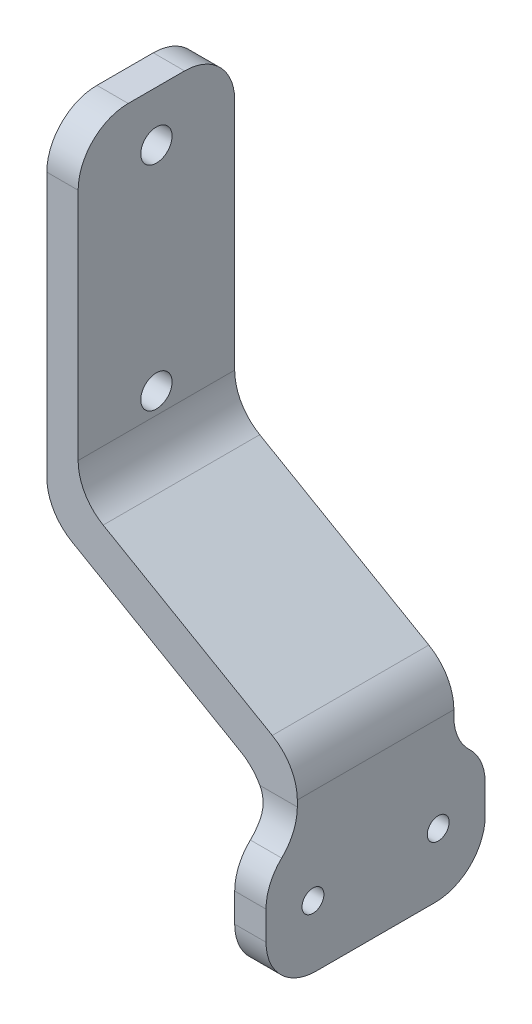
ISO-10303-21;
HEADER;
FILE_DESCRIPTION(('STEP AP214'),'2;1');
FILE_NAME('part.step','',(''),(''),'','','');
FILE_SCHEMA(('AUTOMOTIVE_DESIGN { 1 0 10303 214 1 1 1 1 }'));
ENDSEC;
DATA;
#1=APPLICATION_CONTEXT('core data for automotive mechanical design processes');
#2=APPLICATION_PROTOCOL_DEFINITION('international standard','automotive_design',2000,#1);
#3=PRODUCT_CONTEXT('',#1,'mechanical');
#4=PRODUCT('Part','Part','',(#3));
#5=PRODUCT_RELATED_PRODUCT_CATEGORY('part','',(#4));
#6=PRODUCT_DEFINITION_FORMATION('','',#4);
#7=PRODUCT_DEFINITION_CONTEXT('part definition',#1,'design');
#8=PRODUCT_DEFINITION('design','',#6,#7);
#9=PRODUCT_DEFINITION_SHAPE('','',#8);
#10=(LENGTH_UNIT() NAMED_UNIT(*) SI_UNIT(.MILLI.,.METRE.));
#11=(NAMED_UNIT(*) PLANE_ANGLE_UNIT() SI_UNIT($,.RADIAN.));
#12=(NAMED_UNIT(*) SI_UNIT($,.STERADIAN.) SOLID_ANGLE_UNIT());
#13=UNCERTAINTY_MEASURE_WITH_UNIT(LENGTH_MEASURE(1.E-05),#10,'distance_accuracy_value','');
#14=(GEOMETRIC_REPRESENTATION_CONTEXT(3) GLOBAL_UNCERTAINTY_ASSIGNED_CONTEXT((#13)) GLOBAL_UNIT_ASSIGNED_CONTEXT((#10,
#11,#12)) REPRESENTATION_CONTEXT('',''));
#15=CARTESIAN_POINT('',(0.,0.,0.));
#16=DIRECTION('',(0.,0.,1.));
#17=DIRECTION('',(1.,0.,0.));
#18=AXIS2_PLACEMENT_3D('',#15,#16,#17);
#19=CARTESIAN_POINT('',(0.,0.,12.5));
#20=DIRECTION('',(0.,0.,-1.));
#21=DIRECTION('',(-1.,0.,0.));
#22=AXIS2_PLACEMENT_3D('',#19,#20,#21);
#23=PLANE('',#22);
#24=CARTESIAN_POINT('',(22.,-4.61880215351701,12.5));
#25=DIRECTION('',(0.,0.,-1.));
#26=DIRECTION('',(-1.,0.,0.));
#27=AXIS2_PLACEMENT_3D('',#24,#25,#26);
#28=CIRCLE('',#27,8.);
#29=CARTESIAN_POINT('',(26.,2.3094010767585,12.5));
#30=VERTEX_POINT('',#29);
#31=CARTESIAN_POINT('',(29.0282093935417,-0.797248448473425,12.5));
#32=VERTEX_POINT('',#31);
#33=EDGE_CURVE('E350',#30,#32,#28,.T.);
#34=ORIENTED_EDGE('',*,*,#33,.T.);
#35=DIRECTION('',(-1.,0.,0.));
#36=VECTOR('',#35,1.);
#37=CARTESIAN_POINT('',(0.,-0.797248448473424,12.5));
#38=LINE('',#37,#36);
#39=CARTESIAN_POINT('',(35.,-0.797248448473424,12.5));
#40=VERTEX_POINT('',#39);
#41=EDGE_CURVE('E371',#32,#40,#38,.F.);
#42=ORIENTED_EDGE('',*,*,#41,.T.);
#43=DIRECTION('',(0.,-1.,0.));
#44=VECTOR('',#43,1.);
#45=CARTESIAN_POINT('',(35.,0.,12.5));
#46=LINE('',#45,#44);
#47=CARTESIAN_POINT('',(35.,0.173938424846068,12.5));
#48=VERTEX_POINT('',#47);
#49=EDGE_CURVE('E224',#48,#40,#46,.T.);
#50=ORIENTED_EDGE('',*,*,#49,.F.);
#51=CARTESIAN_POINT('',(27.,0.173938424846068,12.5));
#52=DIRECTION('',(0.,0.,-1.));
#53=DIRECTION('',(-1.,0.,0.));
#54=AXIS2_PLACEMENT_3D('',#51,#52,#53);
#55=CIRCLE('',#54,8.);
#56=CARTESIAN_POINT('',(31.,7.10214165512157,12.5));
#57=VERTEX_POINT('',#56);
#58=EDGE_CURVE('E300',#48,#57,#55,.F.);
#59=ORIENTED_EDGE('',*,*,#58,.T.);
#60=DIRECTION('',(-0.866025403784438,0.500000000000001,0.));
#61=VECTOR('',#60,1.);
#62=CARTESIAN_POINT('',(35.,4.79274057836307,12.5));
#63=LINE('',#62,#61);
#64=CARTESIAN_POINT('',(3.99999999999998,22.6905989232415,12.5));
#65=VERTEX_POINT('',#64);
#66=EDGE_CURVE('E230',#57,#65,#63,.T.);
#67=ORIENTED_EDGE('',*,*,#66,.T.);
#68=CARTESIAN_POINT('',(8.,29.618802153517,12.5));
#69=DIRECTION('',(0.,0.,-1.));
#70=DIRECTION('',(-1.,0.,0.));
#71=AXIS2_PLACEMENT_3D('',#68,#69,#70);
#72=CIRCLE('',#71,8.);
#73=CARTESIAN_POINT('',(0.,29.618802153517,12.5));
#74=VERTEX_POINT('',#73);
#75=EDGE_CURVE('E357',#65,#74,#72,.T.);
#76=ORIENTED_EDGE('',*,*,#75,.T.);
#77=DIRECTION('',(0.,1.,0.));
#78=VECTOR('',#77,1.);
#79=CARTESIAN_POINT('',(0.,0.,12.5));
#80=LINE('',#79,#78);
#81=CARTESIAN_POINT('',(0.,67.,12.5));
#82=VERTEX_POINT('',#81);
#83=EDGE_CURVE('E515',#74,#82,#80,.T.);
#84=ORIENTED_EDGE('',*,*,#83,.T.);
#85=DIRECTION('',(1.,0.,0.));
#86=VECTOR('',#85,1.);
#87=CARTESIAN_POINT('',(-5.,67.,12.5));
#88=LINE('',#87,#86);
#89=CARTESIAN_POINT('',(-5.,67.,12.5));
#90=VERTEX_POINT('',#89);
#91=EDGE_CURVE('E294',#82,#90,#88,.F.);
#92=ORIENTED_EDGE('',*,*,#91,.T.);
#93=DIRECTION('',(0.,1.,0.));
#94=VECTOR('',#93,1.);
#95=CARTESIAN_POINT('',(-5.,0.,12.5));
#96=LINE('',#95,#94);
#97=CARTESIAN_POINT('',(-5.,24.8260615751539,12.5));
#98=VERTEX_POINT('',#97);
#99=EDGE_CURVE('E535',#98,#90,#96,.T.);
#100=ORIENTED_EDGE('',*,*,#99,.F.);
#101=CARTESIAN_POINT('',(3.,24.8260615751539,12.5));
#102=DIRECTION('',(0.,0.,-1.));
#103=DIRECTION('',(-1.,0.,0.));
#104=AXIS2_PLACEMENT_3D('',#101,#102,#103);
#105=CIRCLE('',#104,8.);
#106=CARTESIAN_POINT('',(-1.00000000000001,17.8978583448784,12.5));
#107=VERTEX_POINT('',#106);
#108=EDGE_CURVE('E297',#98,#107,#105,.F.);
#109=ORIENTED_EDGE('',*,*,#108,.T.);
#110=DIRECTION('',(0.866025403784438,-0.500000000000001,0.));
#111=VECTOR('',#110,1.);
#112=CARTESIAN_POINT('',(-5.,20.2072594216369,12.5));
#113=LINE('',#112,#111);
#114=EDGE_CURVE('E234',#107,#30,#113,.T.);
#115=ORIENTED_EDGE('',*,*,#114,.T.);
#116=EDGE_LOOP('',(#34,#42,#50,#59,#67,#76,#84,#92,#100,#109,#115));
#117=FACE_BOUND('',#116,.T.);
#118=ADVANCED_FACE('F43',(#117),#23,.F.);
#119=CARTESIAN_POINT('',(0.,0.,-12.5));
#120=DIRECTION('',(0.,0.,-1.));
#121=DIRECTION('',(-1.,0.,0.));
#122=AXIS2_PLACEMENT_3D('',#119,#120,#121);
#123=PLANE('',#122);
#124=DIRECTION('',(0.,1.,0.));
#125=VECTOR('',#124,1.);
#126=CARTESIAN_POINT('',(35.,0.,-12.5));
#127=LINE('',#126,#125);
#128=CARTESIAN_POINT('',(35.,-0.797248448473403,-12.5));
#129=VERTEX_POINT('',#128);
#130=CARTESIAN_POINT('',(35.,0.173938424846068,-12.5));
#131=VERTEX_POINT('',#130);
#132=EDGE_CURVE('E235',#129,#131,#127,.T.);
#133=ORIENTED_EDGE('',*,*,#132,.F.);
#134=DIRECTION('',(1.,0.,0.));
#135=VECTOR('',#134,1.);
#136=CARTESIAN_POINT('',(30.,-0.797248448473403,-12.5));
#137=LINE('',#136,#135);
#138=CARTESIAN_POINT('',(29.0282093935417,-0.797248448473402,-12.5));
#139=VERTEX_POINT('',#138);
#140=EDGE_CURVE('E360',#129,#139,#137,.F.);
#141=ORIENTED_EDGE('',*,*,#140,.T.);
#142=CARTESIAN_POINT('',(22.,-4.61880215351701,-12.5));
#143=DIRECTION('',(0.,0.,-1.));
#144=DIRECTION('',(-1.,0.,0.));
#145=AXIS2_PLACEMENT_3D('',#142,#143,#144);
#146=CIRCLE('',#145,8.);
#147=CARTESIAN_POINT('',(26.,2.3094010767585,-12.5));
#148=VERTEX_POINT('',#147);
#149=EDGE_CURVE('E347',#139,#148,#146,.F.);
#150=ORIENTED_EDGE('',*,*,#149,.T.);
#151=DIRECTION('',(-0.866025403784438,0.500000000000001,0.));
#152=VECTOR('',#151,1.);
#153=CARTESIAN_POINT('',(7.50000000000002,12.9903810567666,-12.5));
#154=LINE('',#153,#152);
#155=CARTESIAN_POINT('',(-1.,17.8978583448784,-12.5));
#156=VERTEX_POINT('',#155);
#157=EDGE_CURVE('E243',#148,#156,#154,.T.);
#158=ORIENTED_EDGE('',*,*,#157,.T.);
#159=CARTESIAN_POINT('',(3.,24.8260615751539,-12.5));
#160=DIRECTION('',(0.,0.,-1.));
#161=DIRECTION('',(-1.,0.,0.));
#162=AXIS2_PLACEMENT_3D('',#159,#160,#161);
#163=CIRCLE('',#162,8.);
#164=CARTESIAN_POINT('',(-5.,24.8260615751539,-12.5));
#165=VERTEX_POINT('',#164);
#166=EDGE_CURVE('E313',#156,#165,#163,.T.);
#167=ORIENTED_EDGE('',*,*,#166,.T.);
#168=DIRECTION('',(0.,1.,0.));
#169=VECTOR('',#168,1.);
#170=CARTESIAN_POINT('',(-5.,0.,-12.5));
#171=LINE('',#170,#169);
#172=CARTESIAN_POINT('',(-5.,67.,-12.5));
#173=VERTEX_POINT('',#172);
#174=EDGE_CURVE('E226',#165,#173,#171,.T.);
#175=ORIENTED_EDGE('',*,*,#174,.T.);
#176=DIRECTION('',(1.,0.,0.));
#177=VECTOR('',#176,1.);
#178=CARTESIAN_POINT('',(0.,67.,-12.5));
#179=LINE('',#178,#177);
#180=CARTESIAN_POINT('',(0.,67.,-12.5));
#181=VERTEX_POINT('',#180);
#182=EDGE_CURVE('E309',#173,#181,#179,.T.);
#183=ORIENTED_EDGE('',*,*,#182,.T.);
#184=DIRECTION('',(0.,1.,0.));
#185=VECTOR('',#184,1.);
#186=CARTESIAN_POINT('',(0.,0.,-12.5));
#187=LINE('',#186,#185);
#188=CARTESIAN_POINT('',(0.,29.618802153517,-12.5));
#189=VERTEX_POINT('',#188);
#190=EDGE_CURVE('E523',#189,#181,#187,.T.);
#191=ORIENTED_EDGE('',*,*,#190,.F.);
#192=CARTESIAN_POINT('',(8.,29.618802153517,-12.5));
#193=DIRECTION('',(0.,0.,-1.));
#194=DIRECTION('',(-1.,0.,0.));
#195=AXIS2_PLACEMENT_3D('',#192,#193,#194);
#196=CIRCLE('',#195,8.);
#197=CARTESIAN_POINT('',(3.99999999999999,22.6905989232415,-12.5));
#198=VERTEX_POINT('',#197);
#199=EDGE_CURVE('E354',#189,#198,#196,.F.);
#200=ORIENTED_EDGE('',*,*,#199,.T.);
#201=DIRECTION('',(0.866025403784438,-0.500000000000001,0.));
#202=VECTOR('',#201,1.);
#203=CARTESIAN_POINT('',(10.8253175473055,18.75,-12.5));
#204=LINE('',#203,#202);
#205=CARTESIAN_POINT('',(31.,7.10214165512157,-12.5));
#206=VERTEX_POINT('',#205);
#207=EDGE_CURVE('E239',#198,#206,#204,.T.);
#208=ORIENTED_EDGE('',*,*,#207,.T.);
#209=CARTESIAN_POINT('',(27.,0.173938424846068,-12.5));
#210=DIRECTION('',(0.,0.,-1.));
#211=DIRECTION('',(-1.,0.,0.));
#212=AXIS2_PLACEMENT_3D('',#209,#210,#211);
#213=CIRCLE('',#212,8.);
#214=EDGE_CURVE('E316',#206,#131,#213,.T.);
#215=ORIENTED_EDGE('',*,*,#214,.T.);
#216=EDGE_LOOP('',(#133,#141,#150,#158,#167,#175,#183,#191,#200,#208,#215));
#217=FACE_BOUND('',#216,.T.);
#218=ADVANCED_FACE('F417',(#217),#123,.T.);
#219=CARTESIAN_POINT('',(30.,0.,0.));
#220=DIRECTION('',(1.,0.,0.));
#221=DIRECTION('',(0.,0.,-1.));
#222=AXIS2_PLACEMENT_3D('',#219,#220,#221);
#223=PLANE('',#222);
#224=CARTESIAN_POINT('',(30.,-15.,10.));
#225=DIRECTION('',(1.,0.,0.));
#226=DIRECTION('',(0.,0.,-1.));
#227=AXIS2_PLACEMENT_3D('',#224,#225,#226);
#228=CIRCLE('',#227,1.75);
#229=CARTESIAN_POINT('',(30.,-15.,8.25));
#230=VERTEX_POINT('',#229);
#231=EDGE_CURVE('E529',#230,#230,#228,.T.);
#232=ORIENTED_EDGE('',*,*,#231,.T.);
#233=EDGE_LOOP('',(#232));
#234=FACE_BOUND('',#233,.T.);
#235=CARTESIAN_POINT('',(30.,-15.,-10.));
#236=DIRECTION('',(1.,0.,0.));
#237=DIRECTION('',(0.,0.,-1.));
#238=AXIS2_PLACEMENT_3D('',#235,#236,#237);
#239=CIRCLE('',#238,1.75);
#240=CARTESIAN_POINT('',(30.,-15.,-11.75));
#241=VERTEX_POINT('',#240);
#242=EDGE_CURVE('E545',#241,#241,#239,.T.);
#243=ORIENTED_EDGE('',*,*,#242,.T.);
#244=EDGE_LOOP('',(#243));
#245=FACE_BOUND('',#244,.T.);
#246=DIRECTION('',(0.,0.,-1.));
#247=VECTOR('',#246,1.);
#248=CARTESIAN_POINT('',(30.,-25.,0.));
#249=LINE('',#248,#247);
#250=CARTESIAN_POINT('',(30.,-25.,9.49999999999998));
#251=VERTEX_POINT('',#250);
#252=CARTESIAN_POINT('',(30.,-25.,-9.50000000000002));
#253=VERTEX_POINT('',#252);
#254=EDGE_CURVE('E207',#251,#253,#249,.T.);
#255=ORIENTED_EDGE('',*,*,#254,.F.);
#256=CARTESIAN_POINT('',(30.,-17.,9.49999999999998));
#257=DIRECTION('',(1.,0.,0.));
#258=DIRECTION('',(0.,0.,-1.));
#259=AXIS2_PLACEMENT_3D('',#256,#257,#258);
#260=CIRCLE('',#259,8.);
#261=CARTESIAN_POINT('',(30.,-17.,17.5));
#262=VERTEX_POINT('',#261);
#263=EDGE_CURVE('E190',#251,#262,#260,.F.);
#264=ORIENTED_EDGE('',*,*,#263,.T.);
#265=DIRECTION('',(0.,1.,0.));
#266=VECTOR('',#265,1.);
#267=CARTESIAN_POINT('',(30.,0.,17.5));
#268=LINE('',#267,#266);
#269=CARTESIAN_POINT('',(30.,-12.4161984870957,17.5));
#270=VERTEX_POINT('',#269);
#271=EDGE_CURVE('E219',#262,#270,#268,.T.);
#272=ORIENTED_EDGE('',*,*,#271,.T.);
#273=CARTESIAN_POINT('',(30.,-12.4161984870957,9.49999999999999));
#274=DIRECTION('',(1.,0.,0.));
#275=DIRECTION('',(0.,0.,-1.));
#276=AXIS2_PLACEMENT_3D('',#273,#274,#275);
#277=CIRCLE('',#276,8.);
#278=CARTESIAN_POINT('',(30.,-6.60672346778454,15.));
#279=VERTEX_POINT('',#278);
#280=EDGE_CURVE('E201',#270,#279,#277,.F.);
#281=ORIENTED_EDGE('',*,*,#280,.T.);
#282=CARTESIAN_POINT('',(30.,-0.797248448473424,20.5));
#283=DIRECTION('',(1.,0.,0.));
#284=DIRECTION('',(0.,0.,-1.));
#285=AXIS2_PLACEMENT_3D('',#282,#283,#284);
#286=CIRCLE('',#285,8.);
#287=CARTESIAN_POINT('',(30.,-4.61880215351701,13.4717906064583));
#288=VERTEX_POINT('',#287);
#289=EDGE_CURVE('E468',#279,#288,#286,.T.);
#290=ORIENTED_EDGE('',*,*,#289,.T.);
#291=DIRECTION('',(0.,0.,-1.));
#292=VECTOR('',#291,1.);
#293=CARTESIAN_POINT('',(30.,-4.61880215351701,0.));
#294=LINE('',#293,#292);
#295=CARTESIAN_POINT('',(30.,-4.61880215351701,-13.4717906064583));
#296=VERTEX_POINT('',#295);
#297=EDGE_CURVE('E60',#288,#296,#294,.T.);
#298=ORIENTED_EDGE('',*,*,#297,.T.);
#299=CARTESIAN_POINT('',(30.,-0.797248448473403,-20.5));
#300=DIRECTION('',(1.,0.,0.));
#301=DIRECTION('',(0.,0.,-1.));
#302=AXIS2_PLACEMENT_3D('',#299,#300,#301);
#303=CIRCLE('',#302,8.);
#304=CARTESIAN_POINT('',(30.,-6.60672346778454,-15.));
#305=VERTEX_POINT('',#304);
#306=EDGE_CURVE('E382',#296,#305,#303,.T.);
#307=ORIENTED_EDGE('',*,*,#306,.T.);
#308=CARTESIAN_POINT('',(30.,-12.4161984870957,-9.50000000000002));
#309=DIRECTION('',(1.,0.,0.));
#310=DIRECTION('',(0.,0.,-1.));
#311=AXIS2_PLACEMENT_3D('',#308,#309,#310);
#312=CIRCLE('',#311,8.);
#313=CARTESIAN_POINT('',(30.,-12.4161984870957,-17.5));
#314=VERTEX_POINT('',#313);
#315=EDGE_CURVE('E251',#305,#314,#312,.F.);
#316=ORIENTED_EDGE('',*,*,#315,.T.);
#317=DIRECTION('',(0.,1.,0.));
#318=VECTOR('',#317,1.);
#319=CARTESIAN_POINT('',(30.,0.,-17.5));
#320=LINE('',#319,#318);
#321=CARTESIAN_POINT('',(30.,-17.,-17.5));
#322=VERTEX_POINT('',#321);
#323=EDGE_CURVE('E218',#322,#314,#320,.T.);
#324=ORIENTED_EDGE('',*,*,#323,.F.);
#325=CARTESIAN_POINT('',(30.,-17.,-9.50000000000002));
#326=DIRECTION('',(1.,0.,0.));
#327=DIRECTION('',(0.,0.,-1.));
#328=AXIS2_PLACEMENT_3D('',#325,#326,#327);
#329=CIRCLE('',#328,8.);
#330=EDGE_CURVE('E216',#322,#253,#329,.F.);
#331=ORIENTED_EDGE('',*,*,#330,.T.);
#332=EDGE_LOOP('',(#255,#264,#272,#281,#290,#298,#307,#316,#324,#331));
#333=FACE_BOUND('',#332,.T.);
#334=ADVANCED_FACE('F214',(#234,#245,#333),#223,.F.);
#335=CARTESIAN_POINT('',(35.,0.,17.5));
#336=DIRECTION('',(0.,0.,1.));
#337=DIRECTION('',(0.,-1.,0.));
#338=AXIS2_PLACEMENT_3D('',#335,#336,#337);
#339=PLANE('',#338);
#340=ORIENTED_EDGE('',*,*,#271,.F.);
#341=DIRECTION('',(-1.,0.,0.));
#342=VECTOR('',#341,1.);
#343=CARTESIAN_POINT('',(35.,-17.,17.5));
#344=LINE('',#343,#342);
#345=CARTESIAN_POINT('',(35.,-17.,17.5));
#346=VERTEX_POINT('',#345);
#347=EDGE_CURVE('E195',#262,#346,#344,.F.);
#348=ORIENTED_EDGE('',*,*,#347,.T.);
#349=DIRECTION('',(0.,1.,0.));
#350=VECTOR('',#349,1.);
#351=CARTESIAN_POINT('',(35.,0.,17.5));
#352=LINE('',#351,#350);
#353=CARTESIAN_POINT('',(35.,-12.4161984870957,17.5));
#354=VERTEX_POINT('',#353);
#355=EDGE_CURVE('E493',#346,#354,#352,.T.);
#356=ORIENTED_EDGE('',*,*,#355,.T.);
#357=DIRECTION('',(1.,0.,0.));
#358=VECTOR('',#357,1.);
#359=CARTESIAN_POINT('',(30.,-12.4161984870957,17.5));
#360=LINE('',#359,#358);
#361=EDGE_CURVE('E200',#354,#270,#360,.F.);
#362=ORIENTED_EDGE('',*,*,#361,.T.);
#363=EDGE_LOOP('',(#340,#348,#356,#362));
#364=FACE_BOUND('',#363,.T.);
#365=ADVANCED_FACE('F426',(#364),#339,.T.);
#366=CARTESIAN_POINT('',(35.,-25.,0.));
#367=DIRECTION('',(0.,1.,0.));
#368=DIRECTION('',(0.,0.,1.));
#369=AXIS2_PLACEMENT_3D('',#366,#367,#368);
#370=PLANE('',#369);
#371=DIRECTION('',(0.,0.,-1.));
#372=VECTOR('',#371,1.);
#373=CARTESIAN_POINT('',(35.,-25.,0.));
#374=LINE('',#373,#372);
#375=CARTESIAN_POINT('',(35.,-25.,9.49999999999998));
#376=VERTEX_POINT('',#375);
#377=CARTESIAN_POINT('',(35.,-25.,-9.50000000000002));
#378=VERTEX_POINT('',#377);
#379=EDGE_CURVE('E210',#376,#378,#374,.T.);
#380=ORIENTED_EDGE('',*,*,#379,.F.);
#381=DIRECTION('',(-1.,0.,0.));
#382=VECTOR('',#381,1.);
#383=CARTESIAN_POINT('',(30.,-25.,9.49999999999998));
#384=LINE('',#383,#382);
#385=EDGE_CURVE('E194',#376,#251,#384,.T.);
#386=ORIENTED_EDGE('',*,*,#385,.T.);
#387=ORIENTED_EDGE('',*,*,#254,.T.);
#388=DIRECTION('',(-1.,0.,0.));
#389=VECTOR('',#388,1.);
#390=CARTESIAN_POINT('',(35.,-25.,-9.50000000000002));
#391=LINE('',#390,#389);
#392=EDGE_CURVE('E212',#253,#378,#391,.F.);
#393=ORIENTED_EDGE('',*,*,#392,.T.);
#394=EDGE_LOOP('',(#380,#386,#387,#393));
#395=FACE_BOUND('',#394,.T.);
#396=ADVANCED_FACE('F206',(#395),#370,.F.);
#397=CARTESIAN_POINT('',(35.,0.,-17.5));
#398=DIRECTION('',(0.,0.,1.));
#399=DIRECTION('',(0.,-1.,0.));
#400=AXIS2_PLACEMENT_3D('',#397,#398,#399);
#401=PLANE('',#400);
#402=DIRECTION('',(0.,1.,0.));
#403=VECTOR('',#402,1.);
#404=CARTESIAN_POINT('',(35.,0.,-17.5));
#405=LINE('',#404,#403);
#406=CARTESIAN_POINT('',(35.,-17.,-17.5));
#407=VERTEX_POINT('',#406);
#408=CARTESIAN_POINT('',(35.,-12.4161984870957,-17.5));
#409=VERTEX_POINT('',#408);
#410=EDGE_CURVE('E498',#407,#409,#405,.T.);
#411=ORIENTED_EDGE('',*,*,#410,.F.);
#412=DIRECTION('',(-1.,0.,0.));
#413=VECTOR('',#412,1.);
#414=CARTESIAN_POINT('',(35.,-17.,-17.5));
#415=LINE('',#414,#413);
#416=EDGE_CURVE('E284',#407,#322,#415,.T.);
#417=ORIENTED_EDGE('',*,*,#416,.T.);
#418=ORIENTED_EDGE('',*,*,#323,.T.);
#419=DIRECTION('',(-1.,0.,0.));
#420=VECTOR('',#419,1.);
#421=CARTESIAN_POINT('',(35.,-12.4161984870957,-17.5));
#422=LINE('',#421,#420);
#423=EDGE_CURVE('E281',#314,#409,#422,.F.);
#424=ORIENTED_EDGE('',*,*,#423,.T.);
#425=EDGE_LOOP('',(#411,#417,#418,#424));
#426=FACE_BOUND('',#425,.T.);
#427=ADVANCED_FACE('F611',(#426),#401,.F.);
#428=CARTESIAN_POINT('',(35.,0.,0.));
#429=DIRECTION('',(1.,0.,0.));
#430=DIRECTION('',(0.,0.,-1.));
#431=AXIS2_PLACEMENT_3D('',#428,#429,#430);
#432=PLANE('',#431);
#433=CARTESIAN_POINT('',(35.,-15.,10.));
#434=DIRECTION('',(1.,0.,0.));
#435=DIRECTION('',(0.,0.,-1.));
#436=AXIS2_PLACEMENT_3D('',#433,#434,#435);
#437=CIRCLE('',#436,1.75);
#438=CARTESIAN_POINT('',(35.,-15.,8.25));
#439=VERTEX_POINT('',#438);
#440=EDGE_CURVE('E549',#439,#439,#437,.T.);
#441=ORIENTED_EDGE('',*,*,#440,.F.);
#442=EDGE_LOOP('',(#441));
#443=FACE_BOUND('',#442,.T.);
#444=CARTESIAN_POINT('',(35.,-15.,-10.));
#445=DIRECTION('',(1.,0.,0.));
#446=DIRECTION('',(0.,0.,-1.));
#447=AXIS2_PLACEMENT_3D('',#444,#445,#446);
#448=CIRCLE('',#447,1.75);
#449=CARTESIAN_POINT('',(35.,-15.,-11.75));
#450=VERTEX_POINT('',#449);
#451=EDGE_CURVE('E550',#450,#450,#448,.T.);
#452=ORIENTED_EDGE('',*,*,#451,.F.);
#453=EDGE_LOOP('',(#452));
#454=FACE_BOUND('',#453,.T.);
#455=ORIENTED_EDGE('',*,*,#355,.F.);
#456=CARTESIAN_POINT('',(35.,-17.,9.49999999999998));
#457=DIRECTION('',(1.,0.,0.));
#458=DIRECTION('',(0.,0.,-1.));
#459=AXIS2_PLACEMENT_3D('',#456,#457,#458);
#460=CIRCLE('',#459,8.);
#461=EDGE_CURVE('E278',#346,#376,#460,.T.);
#462=ORIENTED_EDGE('',*,*,#461,.T.);
#463=ORIENTED_EDGE('',*,*,#379,.T.);
#464=CARTESIAN_POINT('',(35.,-17.,-9.50000000000002));
#465=DIRECTION('',(1.,0.,0.));
#466=DIRECTION('',(0.,0.,-1.));
#467=AXIS2_PLACEMENT_3D('',#464,#465,#466);
#468=CIRCLE('',#467,8.);
#469=EDGE_CURVE('E272',#378,#407,#468,.T.);
#470=ORIENTED_EDGE('',*,*,#469,.T.);
#471=ORIENTED_EDGE('',*,*,#410,.T.);
#472=CARTESIAN_POINT('',(35.,-12.4161984870957,-9.50000000000002));
#473=DIRECTION('',(1.,0.,0.));
#474=DIRECTION('',(0.,0.,-1.));
#475=AXIS2_PLACEMENT_3D('',#472,#473,#474);
#476=CIRCLE('',#475,8.);
#477=CARTESIAN_POINT('',(35.,-6.60672346778454,-15.));
#478=VERTEX_POINT('',#477);
#479=EDGE_CURVE('E268',#409,#478,#476,.T.);
#480=ORIENTED_EDGE('',*,*,#479,.T.);
#481=CARTESIAN_POINT('',(35.,-0.797248448473403,-20.5));
#482=DIRECTION('',(1.,0.,0.));
#483=DIRECTION('',(0.,0.,-1.));
#484=AXIS2_PLACEMENT_3D('',#481,#482,#483);
#485=CIRCLE('',#484,8.);
#486=EDGE_CURVE('E464',#478,#129,#485,.F.);
#487=ORIENTED_EDGE('',*,*,#486,.T.);
#488=ORIENTED_EDGE('',*,*,#132,.T.);
#489=DIRECTION('',(0.,0.,1.));
#490=VECTOR('',#489,1.);
#491=CARTESIAN_POINT('',(35.,0.173938424846068,0.));
#492=LINE('',#491,#490);
#493=EDGE_CURVE('E264',#131,#48,#492,.T.);
#494=ORIENTED_EDGE('',*,*,#493,.T.);
#495=ORIENTED_EDGE('',*,*,#49,.T.);
#496=CARTESIAN_POINT('',(35.,-0.797248448473424,20.5));
#497=DIRECTION('',(1.,0.,0.));
#498=DIRECTION('',(0.,0.,-1.));
#499=AXIS2_PLACEMENT_3D('',#496,#497,#498);
#500=CIRCLE('',#499,8.);
#501=CARTESIAN_POINT('',(35.,-6.60672346778454,15.));
#502=VERTEX_POINT('',#501);
#503=EDGE_CURVE('E11',#40,#502,#500,.F.);
#504=ORIENTED_EDGE('',*,*,#503,.T.);
#505=CARTESIAN_POINT('',(35.,-12.4161984870957,9.49999999999999));
#506=DIRECTION('',(1.,0.,0.));
#507=DIRECTION('',(0.,0.,-1.));
#508=AXIS2_PLACEMENT_3D('',#505,#506,#507);
#509=CIRCLE('',#508,8.);
#510=EDGE_CURVE('E275',#502,#354,#509,.T.);
#511=ORIENTED_EDGE('',*,*,#510,.T.);
#512=EDGE_LOOP('',(#455,#462,#463,#470,#471,#480,#487,#488,#494,#495,#504,#511));
#513=FACE_BOUND('',#512,.T.);
#514=ADVANCED_FACE('F489',(#443,#454,#513),#432,.T.);
#515=CARTESIAN_POINT('',(0.,0.,0.));
#516=DIRECTION('',(-1.,0.,0.));
#517=DIRECTION('',(0.,0.,1.));
#518=AXIS2_PLACEMENT_3D('',#515,#516,#517);
#519=PLANE('',#518);
#520=CARTESIAN_POINT('',(0.,67.,0.));
#521=DIRECTION('',(1.,0.,0.));
#522=DIRECTION('',(0.,0.,-1.));
#523=AXIS2_PLACEMENT_3D('',#520,#521,#522);
#524=CIRCLE('',#523,2.5);
#525=CARTESIAN_POINT('',(0.,67.,-2.5));
#526=VERTEX_POINT('',#525);
#527=EDGE_CURVE('E566',#526,#526,#524,.T.);
#528=ORIENTED_EDGE('',*,*,#527,.F.);
#529=EDGE_LOOP('',(#528));
#530=FACE_BOUND('',#529,.T.);
#531=CARTESIAN_POINT('',(0.,33.,0.));
#532=DIRECTION('',(1.,0.,0.));
#533=DIRECTION('',(0.,0.,-1.));
#534=AXIS2_PLACEMENT_3D('',#531,#532,#533);
#535=CIRCLE('',#534,2.5);
#536=CARTESIAN_POINT('',(0.,33.,-2.5));
#537=VERTEX_POINT('',#536);
#538=EDGE_CURVE('E558',#537,#537,#535,.T.);
#539=ORIENTED_EDGE('',*,*,#538,.F.);
#540=EDGE_LOOP('',(#539));
#541=FACE_BOUND('',#540,.T.);
#542=ORIENTED_EDGE('',*,*,#83,.F.);
#543=DIRECTION('',(0.,0.,-1.));
#544=VECTOR('',#543,1.);
#545=CARTESIAN_POINT('',(0.,29.618802153517,0.));
#546=LINE('',#545,#544);
#547=EDGE_CURVE('E336',#74,#189,#546,.T.);
#548=ORIENTED_EDGE('',*,*,#547,.T.);
#549=ORIENTED_EDGE('',*,*,#190,.T.);
#550=CARTESIAN_POINT('',(0.,67.,-4.5));
#551=DIRECTION('',(-1.,0.,0.));
#552=DIRECTION('',(0.,0.,1.));
#553=AXIS2_PLACEMENT_3D('',#550,#551,#552);
#554=CIRCLE('',#553,8.);
#555=CARTESIAN_POINT('',(0.,75.,-4.5));
#556=VERTEX_POINT('',#555);
#557=EDGE_CURVE('E330',#181,#556,#554,.F.);
#558=ORIENTED_EDGE('',*,*,#557,.T.);
#559=DIRECTION('',(0.,0.,1.));
#560=VECTOR('',#559,1.);
#561=CARTESIAN_POINT('',(0.,75.,-12.5));
#562=LINE('',#561,#560);
#563=CARTESIAN_POINT('',(0.,75.,4.5));
#564=VERTEX_POINT('',#563);
#565=EDGE_CURVE('E524',#556,#564,#562,.T.);
#566=ORIENTED_EDGE('',*,*,#565,.T.);
#567=CARTESIAN_POINT('',(0.,67.,4.5));
#568=DIRECTION('',(-1.,0.,0.));
#569=DIRECTION('',(0.,0.,1.));
#570=AXIS2_PLACEMENT_3D('',#567,#568,#569);
#571=CIRCLE('',#570,8.);
#572=EDGE_CURVE('E333',#564,#82,#571,.F.);
#573=ORIENTED_EDGE('',*,*,#572,.T.);
#574=EDGE_LOOP('',(#542,#548,#549,#558,#566,#573));
#575=FACE_BOUND('',#574,.T.);
#576=ADVANCED_FACE('F518',(#530,#541,#575),#519,.F.);
#577=CARTESIAN_POINT('',(-5.,75.,-12.5));
#578=DIRECTION('',(0.,1.,0.));
#579=DIRECTION('',(0.,0.,1.));
#580=AXIS2_PLACEMENT_3D('',#577,#578,#579);
#581=PLANE('',#580);
#582=DIRECTION('',(0.,0.,1.));
#583=VECTOR('',#582,1.);
#584=CARTESIAN_POINT('',(-5.,75.,-12.5));
#585=LINE('',#584,#583);
#586=CARTESIAN_POINT('',(-5.,75.,-4.5));
#587=VERTEX_POINT('',#586);
#588=CARTESIAN_POINT('',(-5.,75.,4.5));
#589=VERTEX_POINT('',#588);
#590=EDGE_CURVE('E528',#587,#589,#585,.T.);
#591=ORIENTED_EDGE('',*,*,#590,.T.);
#592=DIRECTION('',(1.,0.,0.));
#593=VECTOR('',#592,1.);
#594=CARTESIAN_POINT('',(0.,75.,4.5));
#595=LINE('',#594,#593);
#596=EDGE_CURVE('E343',#589,#564,#595,.T.);
#597=ORIENTED_EDGE('',*,*,#596,.T.);
#598=ORIENTED_EDGE('',*,*,#565,.F.);
#599=DIRECTION('',(1.,0.,0.));
#600=VECTOR('',#599,1.);
#601=CARTESIAN_POINT('',(-5.,75.,-4.5));
#602=LINE('',#601,#600);
#603=EDGE_CURVE('E340',#556,#587,#602,.F.);
#604=ORIENTED_EDGE('',*,*,#603,.T.);
#605=EDGE_LOOP('',(#591,#597,#598,#604));
#606=FACE_BOUND('',#605,.T.);
#607=ADVANCED_FACE('F585',(#606),#581,.T.);
#608=CARTESIAN_POINT('',(-5.,0.,0.));
#609=DIRECTION('',(-1.,0.,0.));
#610=DIRECTION('',(0.,0.,1.));
#611=AXIS2_PLACEMENT_3D('',#608,#609,#610);
#612=PLANE('',#611);
#613=CARTESIAN_POINT('',(-5.,67.,0.));
#614=DIRECTION('',(1.,0.,0.));
#615=DIRECTION('',(0.,0.,-1.));
#616=AXIS2_PLACEMENT_3D('',#613,#614,#615);
#617=CIRCLE('',#616,2.5);
#618=CARTESIAN_POINT('',(-5.,67.,-2.5));
#619=VERTEX_POINT('',#618);
#620=EDGE_CURVE('E554',#619,#619,#617,.T.);
#621=ORIENTED_EDGE('',*,*,#620,.T.);
#622=EDGE_LOOP('',(#621));
#623=FACE_BOUND('',#622,.T.);
#624=CARTESIAN_POINT('',(-5.,33.,0.));
#625=DIRECTION('',(1.,0.,0.));
#626=DIRECTION('',(0.,0.,-1.));
#627=AXIS2_PLACEMENT_3D('',#624,#625,#626);
#628=CIRCLE('',#627,2.5);
#629=CARTESIAN_POINT('',(-5.,33.,-2.5));
#630=VERTEX_POINT('',#629);
#631=EDGE_CURVE('E562',#630,#630,#628,.T.);
#632=ORIENTED_EDGE('',*,*,#631,.T.);
#633=EDGE_LOOP('',(#632));
#634=FACE_BOUND('',#633,.T.);
#635=ORIENTED_EDGE('',*,*,#174,.F.);
#636=DIRECTION('',(0.,0.,1.));
#637=VECTOR('',#636,1.);
#638=CARTESIAN_POINT('',(-5.,24.8260615751539,0.));
#639=LINE('',#638,#637);
#640=EDGE_CURVE('E326',#165,#98,#639,.T.);
#641=ORIENTED_EDGE('',*,*,#640,.T.);
#642=ORIENTED_EDGE('',*,*,#99,.T.);
#643=CARTESIAN_POINT('',(-5.,67.,4.5));
#644=DIRECTION('',(-1.,0.,0.));
#645=DIRECTION('',(0.,0.,1.));
#646=AXIS2_PLACEMENT_3D('',#643,#644,#645);
#647=CIRCLE('',#646,8.);
#648=EDGE_CURVE('E323',#90,#589,#647,.T.);
#649=ORIENTED_EDGE('',*,*,#648,.T.);
#650=ORIENTED_EDGE('',*,*,#590,.F.);
#651=CARTESIAN_POINT('',(-5.,67.,-4.5));
#652=DIRECTION('',(-1.,0.,0.));
#653=DIRECTION('',(0.,0.,1.));
#654=AXIS2_PLACEMENT_3D('',#651,#652,#653);
#655=CIRCLE('',#654,8.);
#656=EDGE_CURVE('E320',#587,#173,#655,.T.);
#657=ORIENTED_EDGE('',*,*,#656,.T.);
#658=EDGE_LOOP('',(#635,#641,#642,#649,#650,#657));
#659=FACE_BOUND('',#658,.T.);
#660=ADVANCED_FACE('F574',(#623,#634,#659),#612,.T.);
#661=CARTESIAN_POINT('',(-5.,-15.,-10.));
#662=DIRECTION('',(1.,0.,0.));
#663=DIRECTION('',(0.,0.,-1.));
#664=AXIS2_PLACEMENT_3D('',#661,#662,#663);
#665=CYLINDRICAL_SURFACE('',#664,1.75);
#666=ORIENTED_EDGE('',*,*,#451,.T.);
#667=EDGE_LOOP('',(#666));
#668=FACE_BOUND('',#667,.T.);
#669=ORIENTED_EDGE('',*,*,#242,.F.);
#670=EDGE_LOOP('',(#669));
#671=FACE_BOUND('',#670,.T.);
#672=ADVANCED_FACE('F596',(#668,#671),#665,.F.);
#673=CARTESIAN_POINT('',(-5.,-15.,10.));
#674=DIRECTION('',(1.,0.,0.));
#675=DIRECTION('',(0.,0.,-1.));
#676=AXIS2_PLACEMENT_3D('',#673,#674,#675);
#677=CYLINDRICAL_SURFACE('',#676,1.75);
#678=ORIENTED_EDGE('',*,*,#440,.T.);
#679=EDGE_LOOP('',(#678));
#680=FACE_BOUND('',#679,.T.);
#681=ORIENTED_EDGE('',*,*,#231,.F.);
#682=EDGE_LOOP('',(#681));
#683=FACE_BOUND('',#682,.T.);
#684=ADVANCED_FACE('F590',(#680,#683),#677,.F.);
#685=CARTESIAN_POINT('',(-5.,33.,0.));
#686=DIRECTION('',(1.,0.,0.));
#687=DIRECTION('',(0.,0.,-1.));
#688=AXIS2_PLACEMENT_3D('',#685,#686,#687);
#689=CYLINDRICAL_SURFACE('',#688,2.5);
#690=ORIENTED_EDGE('',*,*,#631,.F.);
#691=EDGE_LOOP('',(#690));
#692=FACE_BOUND('',#691,.T.);
#693=ORIENTED_EDGE('',*,*,#538,.T.);
#694=EDGE_LOOP('',(#693));
#695=FACE_BOUND('',#694,.T.);
#696=ADVANCED_FACE('F579',(#692,#695),#689,.F.);
#697=CARTESIAN_POINT('',(-5.,67.,0.));
#698=DIRECTION('',(1.,0.,0.));
#699=DIRECTION('',(0.,0.,-1.));
#700=AXIS2_PLACEMENT_3D('',#697,#698,#699);
#701=CYLINDRICAL_SURFACE('',#700,2.5);
#702=ORIENTED_EDGE('',*,*,#620,.F.);
#703=EDGE_LOOP('',(#702));
#704=FACE_BOUND('',#703,.T.);
#705=ORIENTED_EDGE('',*,*,#527,.T.);
#706=EDGE_LOOP('',(#705));
#707=FACE_BOUND('',#706,.T.);
#708=ADVANCED_FACE('F437',(#704,#707),#701,.F.);
#709=CARTESIAN_POINT('',(-5.,20.2072594216369,0.));
#710=DIRECTION('',(-0.500000000000001,-0.866025403784438,0.));
#711=DIRECTION('',(0.,0.,-1.));
#712=AXIS2_PLACEMENT_3D('',#709,#710,#711);
#713=PLANE('',#712);
#714=ORIENTED_EDGE('',*,*,#157,.F.);
#715=DIRECTION('',(0.,0.,-1.));
#716=VECTOR('',#715,1.);
#717=CARTESIAN_POINT('',(26.,2.3094010767585,0.));
#718=LINE('',#717,#716);
#719=EDGE_CURVE('E291',#148,#30,#718,.F.);
#720=ORIENTED_EDGE('',*,*,#719,.T.);
#721=ORIENTED_EDGE('',*,*,#114,.F.);
#722=DIRECTION('',(0.,0.,1.));
#723=VECTOR('',#722,1.);
#724=CARTESIAN_POINT('',(-1.00000000000001,17.8978583448784,0.));
#725=LINE('',#724,#723);
#726=EDGE_CURVE('E288',#107,#156,#725,.F.);
#727=ORIENTED_EDGE('',*,*,#726,.T.);
#728=EDGE_LOOP('',(#714,#720,#721,#727));
#729=FACE_BOUND('',#728,.T.);
#730=ADVANCED_FACE('F430',(#729),#713,.T.);
#731=CARTESIAN_POINT('',(35.,4.79274057836307,0.));
#732=DIRECTION('',(0.500000000000001,0.866025403784438,0.));
#733=DIRECTION('',(0.,0.,-1.));
#734=AXIS2_PLACEMENT_3D('',#731,#732,#733);
#735=PLANE('',#734);
#736=ORIENTED_EDGE('',*,*,#66,.F.);
#737=DIRECTION('',(0.,0.,1.));
#738=VECTOR('',#737,1.);
#739=CARTESIAN_POINT('',(31.,7.10214165512157,0.));
#740=LINE('',#739,#738);
#741=EDGE_CURVE('E306',#57,#206,#740,.F.);
#742=ORIENTED_EDGE('',*,*,#741,.T.);
#743=ORIENTED_EDGE('',*,*,#207,.F.);
#744=DIRECTION('',(0.,0.,-1.));
#745=VECTOR('',#744,1.);
#746=CARTESIAN_POINT('',(4.,22.6905989232415,0.));
#747=LINE('',#746,#745);
#748=EDGE_CURVE('E303',#198,#65,#747,.F.);
#749=ORIENTED_EDGE('',*,*,#748,.T.);
#750=EDGE_LOOP('',(#736,#742,#743,#749));
#751=FACE_BOUND('',#750,.T.);
#752=ADVANCED_FACE('F436',(#751),#735,.T.);
#753=CARTESIAN_POINT('',(35.,-17.,9.49999999999998));
#754=DIRECTION('',(1.,0.,0.));
#755=DIRECTION('',(0.,0.,-1.));
#756=AXIS2_PLACEMENT_3D('',#753,#754,#755);
#757=CYLINDRICAL_SURFACE('',#756,8.);
#758=ORIENTED_EDGE('',*,*,#461,.F.);
#759=ORIENTED_EDGE('',*,*,#347,.F.);
#760=ORIENTED_EDGE('',*,*,#263,.F.);
#761=ORIENTED_EDGE('',*,*,#385,.F.);
#762=EDGE_LOOP('',(#758,#759,#760,#761));
#763=FACE_BOUND('',#762,.T.);
#764=ADVANCED_FACE('F193',(#763),#757,.T.);
#765=CARTESIAN_POINT('',(35.,-12.4161984870957,9.49999999999999));
#766=DIRECTION('',(-1.,0.,0.));
#767=DIRECTION('',(0.,0.,1.));
#768=AXIS2_PLACEMENT_3D('',#765,#766,#767);
#769=CYLINDRICAL_SURFACE('',#768,8.);
#770=ORIENTED_EDGE('',*,*,#510,.F.);
#771=DIRECTION('',(-1.,0.,0.));
#772=VECTOR('',#771,1.);
#773=CARTESIAN_POINT('',(35.,-6.60672346778454,15.));
#774=LINE('',#773,#772);
#775=EDGE_CURVE('E367',#502,#279,#774,.T.);
#776=ORIENTED_EDGE('',*,*,#775,.T.);
#777=ORIENTED_EDGE('',*,*,#280,.F.);
#778=ORIENTED_EDGE('',*,*,#361,.F.);
#779=EDGE_LOOP('',(#770,#776,#777,#778));
#780=FACE_BOUND('',#779,.T.);
#781=ADVANCED_FACE('F446',(#780),#769,.T.);
#782=CARTESIAN_POINT('',(35.,-17.,-9.50000000000002));
#783=DIRECTION('',(-1.,0.,0.));
#784=DIRECTION('',(0.,0.,1.));
#785=AXIS2_PLACEMENT_3D('',#782,#783,#784);
#786=CYLINDRICAL_SURFACE('',#785,8.);
#787=ORIENTED_EDGE('',*,*,#469,.F.);
#788=ORIENTED_EDGE('',*,*,#392,.F.);
#789=ORIENTED_EDGE('',*,*,#330,.F.);
#790=ORIENTED_EDGE('',*,*,#416,.F.);
#791=EDGE_LOOP('',(#787,#788,#789,#790));
#792=FACE_BOUND('',#791,.T.);
#793=ADVANCED_FACE('F449',(#792),#786,.T.);
#794=CARTESIAN_POINT('',(35.,-12.4161984870957,-9.50000000000002));
#795=DIRECTION('',(-1.,0.,0.));
#796=DIRECTION('',(0.,0.,1.));
#797=AXIS2_PLACEMENT_3D('',#794,#795,#796);
#798=CYLINDRICAL_SURFACE('',#797,8.);
#799=ORIENTED_EDGE('',*,*,#315,.F.);
#800=DIRECTION('',(-1.,0.,0.));
#801=VECTOR('',#800,1.);
#802=CARTESIAN_POINT('',(35.,-6.60672346778454,-15.));
#803=LINE('',#802,#801);
#804=EDGE_CURVE('E364',#305,#478,#803,.F.);
#805=ORIENTED_EDGE('',*,*,#804,.T.);
#806=ORIENTED_EDGE('',*,*,#479,.F.);
#807=ORIENTED_EDGE('',*,*,#423,.F.);
#808=EDGE_LOOP('',(#799,#805,#806,#807));
#809=FACE_BOUND('',#808,.T.);
#810=ADVANCED_FACE('F414',(#809),#798,.T.);
#811=CARTESIAN_POINT('',(22.,-4.61880215351701,0.));
#812=DIRECTION('',(0.,0.,-1.));
#813=DIRECTION('',(-1.,0.,0.));
#814=AXIS2_PLACEMENT_3D('',#811,#812,#813);
#815=CYLINDRICAL_SURFACE('',#814,8.);
#816=ORIENTED_EDGE('',*,*,#33,.F.);
#817=ORIENTED_EDGE('',*,*,#719,.F.);
#818=ORIENTED_EDGE('',*,*,#149,.F.);
#819=CARTESIAN_POINT('',(29.0282093935417,-0.797248448473403,-12.5));
#820=CARTESIAN_POINT('',(29.109961189881,-0.947525809203594,-12.4999719549441));
#821=CARTESIAN_POINT('',(29.1868515217243,-1.10049150021131,-12.504233696992));
#822=CARTESIAN_POINT('',(29.3305308064379,-1.4106270793231,-12.5220439861707));
#823=CARTESIAN_POINT('',(29.3973163449178,-1.56779836747263,-12.5355956638364));
#824=CARTESIAN_POINT('',(29.5185591053298,-1.88044656112885,-12.5721534445957));
#825=CARTESIAN_POINT('',(29.573318890233,-2.0358393575061,-12.5948725068049));
#826=CARTESIAN_POINT('',(29.6727174078338,-2.34806767803147,-12.6501539583019));
#827=CARTESIAN_POINT('',(29.7173583611005,-2.50490287776907,-12.6827141842878));
#828=CARTESIAN_POINT('',(29.7984110448236,-2.82617374291872,-12.7597143442373));
#829=CARTESIAN_POINT('',(29.8343306837518,-2.99061628854422,-12.8046454400501));
#830=CARTESIAN_POINT('',(29.8953187621665,-3.31814382263453,-12.9056285205521));
#831=CARTESIAN_POINT('',(29.9203838017976,-3.48122837008564,-12.9616839815869));
#832=CARTESIAN_POINT('',(29.9607381010006,-3.80958593946115,-13.086660769758));
#833=CARTESIAN_POINT('',(29.9756951815881,-3.97476652506655,-13.1559312334398));
#834=CARTESIAN_POINT('',(29.9953413434161,-4.30055289583606,-13.3056159513387));
#835=CARTESIAN_POINT('',(30.0000346178193,-4.46116052275331,-13.3860256404683));
#836=CARTESIAN_POINT('',(30.,-4.61880215351701,-13.4717906064583));
#837=B_SPLINE_CURVE_WITH_KNOTS('',3,(#819,#820,#821,#822,#823,#824,#825,#826,#827,#828,#829,
#830,#831,#832,#833,#834,#835,#836),.UNSPECIFIED.,.F.,.F.,(4,2,2,2,2,2,2,2,4),(0.,
0.513141039235329,1.02645508247492,1.52480956802296,2.02305458398722,2.5449855056534,
3.06707978742446,3.60559112012098,4.14388240893363),.UNSPECIFIED.);
#838=EDGE_CURVE('E374',#139,#296,#837,.T.);
#839=ORIENTED_EDGE('',*,*,#838,.T.);
#840=ORIENTED_EDGE('',*,*,#297,.F.);
#841=CARTESIAN_POINT('',(30.,-4.61880215351701,13.4717906064583));
#842=CARTESIAN_POINT('',(30.0000280450559,-4.46852479278682,13.390038810119));
#843=CARTESIAN_POINT('',(29.995766303008,-4.3155591017791,13.3131484782757));
#844=CARTESIAN_POINT('',(29.9779560138293,-4.00542352266731,13.1694691935621));
#845=CARTESIAN_POINT('',(29.9644043361636,-3.84825223451778,13.1026836550822));
#846=CARTESIAN_POINT('',(29.9278465554043,-3.53560404086156,12.9814408946701));
#847=CARTESIAN_POINT('',(29.9051274931951,-3.38021124448431,12.926681109767));
#848=CARTESIAN_POINT('',(29.8498460416981,-3.06798292395894,12.8272825921662));
#849=CARTESIAN_POINT('',(29.8172858157122,-2.91114772422134,12.7826416388995));
#850=CARTESIAN_POINT('',(29.7402856557627,-2.58987685907169,12.7015889551764));
#851=CARTESIAN_POINT('',(29.6953545599499,-2.42543431344619,12.6656693162482));
#852=CARTESIAN_POINT('',(29.5943714794479,-2.09790677935588,12.6046812378335));
#853=CARTESIAN_POINT('',(29.5383160184131,-1.93482223190478,12.5796161982024));
#854=CARTESIAN_POINT('',(29.413339230242,-1.60646466252927,12.5392618989994));
#855=CARTESIAN_POINT('',(29.3440687665602,-1.44128407692388,12.5243048184119));
#856=CARTESIAN_POINT('',(29.1943840486613,-1.11549770615436,12.5046586565839));
#857=CARTESIAN_POINT('',(29.1139743595317,-0.954890079237114,12.4999653821807));
#858=CARTESIAN_POINT('',(29.0282093935417,-0.797248448473425,12.5));
#859=B_SPLINE_CURVE_WITH_KNOTS('',3,(#841,#842,#843,#844,#845,#846,#847,#848,#849,#850,#851,
#852,#853,#854,#855,#856,#857,#858),.UNSPECIFIED.,.F.,.F.,(4,2,2,2,2,2,2,2,4),(0.,
0.513141039235329,1.02645508247492,1.52480956802296,2.02305458398722,2.54498550565339,
3.06707978742445,3.60559112012096,4.14388240893361),.UNSPECIFIED.);
#860=EDGE_CURVE('E53',#288,#32,#859,.T.);
#861=ORIENTED_EDGE('',*,*,#860,.T.);
#862=EDGE_LOOP('',(#816,#817,#818,#839,#840,#861));
#863=FACE_BOUND('',#862,.T.);
#864=ADVANCED_FACE('F384',(#863),#815,.F.);
#865=CARTESIAN_POINT('',(27.,0.173938424846068,0.));
#866=DIRECTION('',(0.,0.,1.));
#867=DIRECTION('',(1.,0.,0.));
#868=AXIS2_PLACEMENT_3D('',#865,#866,#867);
#869=CYLINDRICAL_SURFACE('',#868,8.);
#870=ORIENTED_EDGE('',*,*,#214,.F.);
#871=ORIENTED_EDGE('',*,*,#741,.F.);
#872=ORIENTED_EDGE('',*,*,#58,.F.);
#873=ORIENTED_EDGE('',*,*,#493,.F.);
#874=EDGE_LOOP('',(#870,#871,#872,#873));
#875=FACE_BOUND('',#874,.T.);
#876=ADVANCED_FACE('F407',(#875),#869,.T.);
#877=CARTESIAN_POINT('',(3.,24.8260615751539,0.));
#878=DIRECTION('',(0.,0.,1.));
#879=DIRECTION('',(1.,0.,0.));
#880=AXIS2_PLACEMENT_3D('',#877,#878,#879);
#881=CYLINDRICAL_SURFACE('',#880,8.);
#882=ORIENTED_EDGE('',*,*,#166,.F.);
#883=ORIENTED_EDGE('',*,*,#726,.F.);
#884=ORIENTED_EDGE('',*,*,#108,.F.);
#885=ORIENTED_EDGE('',*,*,#640,.F.);
#886=EDGE_LOOP('',(#882,#883,#884,#885));
#887=FACE_BOUND('',#886,.T.);
#888=ADVANCED_FACE('F404',(#887),#881,.T.);
#889=CARTESIAN_POINT('',(8.,29.618802153517,0.));
#890=DIRECTION('',(0.,0.,-1.));
#891=DIRECTION('',(-1.,0.,0.));
#892=AXIS2_PLACEMENT_3D('',#889,#890,#891);
#893=CYLINDRICAL_SURFACE('',#892,8.);
#894=ORIENTED_EDGE('',*,*,#75,.F.);
#895=ORIENTED_EDGE('',*,*,#748,.F.);
#896=ORIENTED_EDGE('',*,*,#199,.F.);
#897=ORIENTED_EDGE('',*,*,#547,.F.);
#898=EDGE_LOOP('',(#894,#895,#896,#897));
#899=FACE_BOUND('',#898,.T.);
#900=ADVANCED_FACE('F400',(#899),#893,.F.);
#901=CARTESIAN_POINT('',(-5.,67.,4.5));
#902=DIRECTION('',(-1.,0.,0.));
#903=DIRECTION('',(0.,0.,1.));
#904=AXIS2_PLACEMENT_3D('',#901,#902,#903);
#905=CYLINDRICAL_SURFACE('',#904,8.);
#906=ORIENTED_EDGE('',*,*,#648,.F.);
#907=ORIENTED_EDGE('',*,*,#91,.F.);
#908=ORIENTED_EDGE('',*,*,#572,.F.);
#909=ORIENTED_EDGE('',*,*,#596,.F.);
#910=EDGE_LOOP('',(#906,#907,#908,#909));
#911=FACE_BOUND('',#910,.T.);
#912=ADVANCED_FACE('F396',(#911),#905,.T.);
#913=CARTESIAN_POINT('',(0.,67.,-4.5));
#914=DIRECTION('',(1.,0.,0.));
#915=DIRECTION('',(0.,0.,-1.));
#916=AXIS2_PLACEMENT_3D('',#913,#914,#915);
#917=CYLINDRICAL_SURFACE('',#916,8.);
#918=ORIENTED_EDGE('',*,*,#656,.F.);
#919=ORIENTED_EDGE('',*,*,#603,.F.);
#920=ORIENTED_EDGE('',*,*,#557,.F.);
#921=ORIENTED_EDGE('',*,*,#182,.F.);
#922=EDGE_LOOP('',(#918,#919,#920,#921));
#923=FACE_BOUND('',#922,.T.);
#924=ADVANCED_FACE('F392',(#923),#917,.T.);
#925=CARTESIAN_POINT('',(35.,-0.797248448473403,-20.5));
#926=DIRECTION('',(-1.,0.,0.));
#927=DIRECTION('',(0.,0.,1.));
#928=AXIS2_PLACEMENT_3D('',#925,#926,#927);
#929=CYLINDRICAL_SURFACE('',#928,8.);
#930=ORIENTED_EDGE('',*,*,#486,.F.);
#931=ORIENTED_EDGE('',*,*,#804,.F.);
#932=ORIENTED_EDGE('',*,*,#306,.F.);
#933=ORIENTED_EDGE('',*,*,#838,.F.);
#934=ORIENTED_EDGE('',*,*,#140,.F.);
#935=EDGE_LOOP('',(#930,#931,#932,#933,#934));
#936=FACE_BOUND('',#935,.T.);
#937=ADVANCED_FACE('F388',(#936),#929,.F.);
#938=CARTESIAN_POINT('',(35.,-0.797248448473424,20.5));
#939=DIRECTION('',(-1.,0.,0.));
#940=DIRECTION('',(0.,0.,1.));
#941=AXIS2_PLACEMENT_3D('',#938,#939,#940);
#942=CYLINDRICAL_SURFACE('',#941,8.);
#943=ORIENTED_EDGE('',*,*,#503,.F.);
#944=ORIENTED_EDGE('',*,*,#41,.F.);
#945=ORIENTED_EDGE('',*,*,#860,.F.);
#946=ORIENTED_EDGE('',*,*,#289,.F.);
#947=ORIENTED_EDGE('',*,*,#775,.F.);
#948=EDGE_LOOP('',(#943,#944,#945,#946,#947));
#949=FACE_BOUND('',#948,.T.);
#950=ADVANCED_FACE('F45',(#949),#942,.F.);
#951=CLOSED_SHELL('',(#118,#218,#334,#365,#396,#427,#514,#576,#607,#660,#672,#684,#696,#708,
#730,#752,#764,#781,#793,#810,#864,#876,#888,#900,#912,#924,#937,#950));
#952=MANIFOLD_SOLID_BREP('B2',#951);
#953=ADVANCED_BREP_SHAPE_REPRESENTATION('',(#18,#952),#14);
#954=SHAPE_DEFINITION_REPRESENTATION(#9,#953);
ENDSEC;
END-ISO-10303-21;
